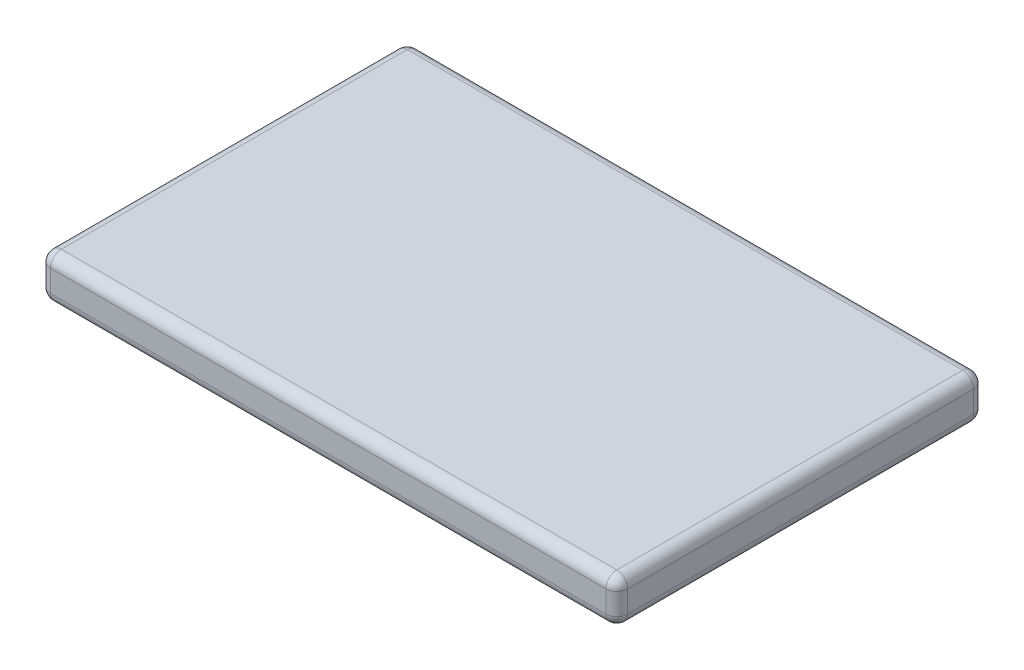
ISO-10303-21;
HEADER;
FILE_DESCRIPTION(('STEP AP214'),'2;1');
FILE_NAME('part.step','',(''),(''),'','','');
FILE_SCHEMA(('AUTOMOTIVE_DESIGN { 1 0 10303 214 1 1 1 1 }'));
ENDSEC;
DATA;
#1=APPLICATION_CONTEXT('core data for automotive mechanical design processes');
#2=APPLICATION_PROTOCOL_DEFINITION('international standard','automotive_design',2000,#1);
#3=PRODUCT_CONTEXT('',#1,'mechanical');
#4=PRODUCT('Part','Part','',(#3));
#5=PRODUCT_RELATED_PRODUCT_CATEGORY('part','',(#4));
#6=PRODUCT_DEFINITION_FORMATION('','',#4);
#7=PRODUCT_DEFINITION_CONTEXT('part definition',#1,'design');
#8=PRODUCT_DEFINITION('design','',#6,#7);
#9=PRODUCT_DEFINITION_SHAPE('','',#8);
#10=(LENGTH_UNIT() NAMED_UNIT(*) SI_UNIT(.MILLI.,.METRE.));
#11=(NAMED_UNIT(*) PLANE_ANGLE_UNIT() SI_UNIT($,.RADIAN.));
#12=(NAMED_UNIT(*) SI_UNIT($,.STERADIAN.) SOLID_ANGLE_UNIT());
#13=UNCERTAINTY_MEASURE_WITH_UNIT(LENGTH_MEASURE(1.E-05),#10,'distance_accuracy_value','');
#14=(GEOMETRIC_REPRESENTATION_CONTEXT(3) GLOBAL_UNCERTAINTY_ASSIGNED_CONTEXT((#13)) GLOBAL_UNIT_ASSIGNED_CONTEXT((#10,
#11,#12)) REPRESENTATION_CONTEXT('',''));
#15=CARTESIAN_POINT('',(0.,0.,0.));
#16=DIRECTION('',(0.,0.,1.));
#17=DIRECTION('',(1.,0.,0.));
#18=AXIS2_PLACEMENT_3D('',#15,#16,#17);
#19=CARTESIAN_POINT('',(50.75,-23.,136.6));
#20=DIRECTION('',(0.,-1.,0.));
#21=DIRECTION('',(1.,0.,0.));
#22=AXIS2_PLACEMENT_3D('',#19,#20,#21);
#23=SPHERICAL_SURFACE('',#22,2.);
#24=CARTESIAN_POINT('',(50.75,-23.,136.6));
#25=DIRECTION('',(0.,0.,-1.));
#26=DIRECTION('',(1.,0.,0.));
#27=AXIS2_PLACEMENT_3D('',#24,#25,#26);
#28=CIRCLE('',#27,2.);
#29=CARTESIAN_POINT('',(50.75,-21.,136.6));
#30=VERTEX_POINT('',#29);
#31=CARTESIAN_POINT('',(52.75,-23.,136.6));
#32=VERTEX_POINT('',#31);
#33=EDGE_CURVE('E10',#30,#32,#28,.T.);
#34=ORIENTED_EDGE('',*,*,#33,.F.);
#35=CARTESIAN_POINT('',(50.75,-23.,136.6));
#36=DIRECTION('',(1.,0.,0.));
#37=DIRECTION('',(0.,0.,1.));
#38=AXIS2_PLACEMENT_3D('',#35,#36,#37);
#39=CIRCLE('',#38,2.);
#40=CARTESIAN_POINT('',(50.75,-23.,138.6));
#41=VERTEX_POINT('',#40);
#42=EDGE_CURVE('E266',#30,#41,#39,.T.);
#43=ORIENTED_EDGE('',*,*,#42,.T.);
#44=CARTESIAN_POINT('',(50.75,-23.,136.6));
#45=DIRECTION('',(0.,-1.,0.));
#46=DIRECTION('',(1.,0.,0.));
#47=AXIS2_PLACEMENT_3D('',#44,#45,#46);
#48=CIRCLE('',#47,2.);
#49=EDGE_CURVE('E265',#32,#41,#48,.T.);
#50=ORIENTED_EDGE('',*,*,#49,.F.);
#51=EDGE_LOOP('',(#34,#43,#50));
#52=FACE_BOUND('',#51,.T.);
#53=ADVANCED_FACE('F16',(#52),#23,.T.);
#54=CARTESIAN_POINT('',(50.75,-23.,73.4));
#55=DIRECTION('',(0.,0.,1.));
#56=DIRECTION('',(1.,0.,0.));
#57=AXIS2_PLACEMENT_3D('',#54,#55,#56);
#58=SPHERICAL_SURFACE('',#57,2.);
#59=CARTESIAN_POINT('',(50.75,-23.,73.4));
#60=DIRECTION('',(0.,-1.,0.));
#61=DIRECTION('',(1.,0.,0.));
#62=AXIS2_PLACEMENT_3D('',#59,#60,#61);
#63=CIRCLE('',#62,2.);
#64=CARTESIAN_POINT('',(50.75,-23.,71.4));
#65=VERTEX_POINT('',#64);
#66=CARTESIAN_POINT('',(52.75,-23.,73.4));
#67=VERTEX_POINT('',#66);
#68=EDGE_CURVE('E275',#65,#67,#63,.T.);
#69=ORIENTED_EDGE('',*,*,#68,.F.);
#70=CARTESIAN_POINT('',(50.75,-23.,73.4));
#71=DIRECTION('',(1.,0.,0.));
#72=DIRECTION('',(0.,1.,0.));
#73=AXIS2_PLACEMENT_3D('',#70,#71,#72);
#74=CIRCLE('',#73,2.);
#75=CARTESIAN_POINT('',(50.75,-21.,73.4));
#76=VERTEX_POINT('',#75);
#77=EDGE_CURVE('E276',#65,#76,#74,.T.);
#78=ORIENTED_EDGE('',*,*,#77,.T.);
#79=CARTESIAN_POINT('',(50.75,-23.,73.4));
#80=DIRECTION('',(0.,0.,1.));
#81=DIRECTION('',(1.,0.,0.));
#82=AXIS2_PLACEMENT_3D('',#79,#80,#81);
#83=CIRCLE('',#82,2.);
#84=EDGE_CURVE('E24',#67,#76,#83,.T.);
#85=ORIENTED_EDGE('',*,*,#84,.F.);
#86=EDGE_LOOP('',(#69,#78,#85));
#87=FACE_BOUND('',#86,.T.);
#88=ADVANCED_FACE('F675',(#87),#58,.T.);
#89=CARTESIAN_POINT('',(52.75,-29.,71.4));
#90=DIRECTION('',(1.,0.,0.));
#91=DIRECTION('',(0.,1.,0.));
#92=AXIS2_PLACEMENT_3D('',#89,#90,#91);
#93=PLANE('',#92);
#94=DIRECTION('',(0.,0.,1.));
#95=VECTOR('',#94,1.);
#96=CARTESIAN_POINT('',(52.75,-27.,71.4));
#97=LINE('',#96,#95);
#98=CARTESIAN_POINT('',(52.75,-27.,73.4));
#99=VERTEX_POINT('',#98);
#100=CARTESIAN_POINT('',(52.75,-27.,136.6));
#101=VERTEX_POINT('',#100);
#102=EDGE_CURVE('E295',#99,#101,#97,.T.);
#103=ORIENTED_EDGE('',*,*,#102,.F.);
#104=DIRECTION('',(0.,1.,0.));
#105=VECTOR('',#104,1.);
#106=CARTESIAN_POINT('',(52.75,-29.,73.4));
#107=LINE('',#106,#105);
#108=EDGE_CURVE('E307',#99,#67,#107,.T.);
#109=ORIENTED_EDGE('',*,*,#108,.T.);
#110=DIRECTION('',(0.,0.,1.));
#111=VECTOR('',#110,1.);
#112=CARTESIAN_POINT('',(52.75,-23.,71.4));
#113=LINE('',#112,#111);
#114=EDGE_CURVE('E298',#67,#32,#113,.T.);
#115=ORIENTED_EDGE('',*,*,#114,.T.);
#116=DIRECTION('',(0.,1.,0.));
#117=VECTOR('',#116,1.);
#118=CARTESIAN_POINT('',(52.75,-29.,136.6));
#119=LINE('',#118,#117);
#120=EDGE_CURVE('E262',#101,#32,#119,.T.);
#121=ORIENTED_EDGE('',*,*,#120,.F.);
#122=EDGE_LOOP('',(#103,#109,#115,#121));
#123=FACE_BOUND('',#122,.T.);
#124=ADVANCED_FACE('F666',(#123),#93,.T.);
#125=CARTESIAN_POINT('',(50.75,-27.,136.6));
#126=DIRECTION('',(0.,0.,-1.));
#127=DIRECTION('',(1.,0.,0.));
#128=AXIS2_PLACEMENT_3D('',#125,#126,#127);
#129=SPHERICAL_SURFACE('',#128,2.);
#130=CARTESIAN_POINT('',(50.75,-27.,136.6));
#131=DIRECTION('',(0.,1.,0.));
#132=DIRECTION('',(1.,0.,0.));
#133=AXIS2_PLACEMENT_3D('',#130,#131,#132);
#134=CIRCLE('',#133,2.);
#135=CARTESIAN_POINT('',(50.75,-27.,138.6));
#136=VERTEX_POINT('',#135);
#137=EDGE_CURVE('E269',#136,#101,#134,.T.);
#138=ORIENTED_EDGE('',*,*,#137,.F.);
#139=CARTESIAN_POINT('',(50.75,-27.,136.6));
#140=DIRECTION('',(1.,0.,0.));
#141=DIRECTION('',(0.,-1.,0.));
#142=AXIS2_PLACEMENT_3D('',#139,#140,#141);
#143=CIRCLE('',#142,2.);
#144=CARTESIAN_POINT('',(50.75,-29.,136.6));
#145=VERTEX_POINT('',#144);
#146=EDGE_CURVE('E253',#136,#145,#143,.T.);
#147=ORIENTED_EDGE('',*,*,#146,.T.);
#148=CARTESIAN_POINT('',(50.75,-27.,136.6));
#149=DIRECTION('',(0.,0.,-1.));
#150=DIRECTION('',(1.,0.,0.));
#151=AXIS2_PLACEMENT_3D('',#148,#149,#150);
#152=CIRCLE('',#151,2.);
#153=EDGE_CURVE('E249',#101,#145,#152,.T.);
#154=ORIENTED_EDGE('',*,*,#153,.F.);
#155=EDGE_LOOP('',(#138,#147,#154));
#156=FACE_BOUND('',#155,.T.);
#157=ADVANCED_FACE('F578',(#156),#129,.T.);
#158=CARTESIAN_POINT('',(50.75,-27.,73.4));
#159=DIRECTION('',(0.,0.,1.));
#160=DIRECTION('',(1.,0.,0.));
#161=AXIS2_PLACEMENT_3D('',#158,#159,#160);
#162=SPHERICAL_SURFACE('',#161,2.);
#163=CARTESIAN_POINT('',(50.75,-27.,73.4));
#164=DIRECTION('',(0.,0.,-1.));
#165=DIRECTION('',(1.,0.,0.));
#166=AXIS2_PLACEMENT_3D('',#163,#164,#165);
#167=CIRCLE('',#166,2.);
#168=CARTESIAN_POINT('',(50.75,-29.,73.4));
#169=VERTEX_POINT('',#168);
#170=EDGE_CURVE('E252',#99,#169,#167,.T.);
#171=ORIENTED_EDGE('',*,*,#170,.T.);
#172=CARTESIAN_POINT('',(50.75,-27.,73.4));
#173=DIRECTION('',(-1.,0.,0.));
#174=DIRECTION('',(0.,-1.,0.));
#175=AXIS2_PLACEMENT_3D('',#172,#173,#174);
#176=CIRCLE('',#175,2.);
#177=CARTESIAN_POINT('',(50.75,-27.,71.4));
#178=VERTEX_POINT('',#177);
#179=EDGE_CURVE('E286',#178,#169,#176,.T.);
#180=ORIENTED_EDGE('',*,*,#179,.F.);
#181=CARTESIAN_POINT('',(50.75,-27.,73.4));
#182=DIRECTION('',(0.,-1.,0.));
#183=DIRECTION('',(1.,0.,0.));
#184=AXIS2_PLACEMENT_3D('',#181,#182,#183);
#185=CIRCLE('',#184,2.);
#186=EDGE_CURVE('E271',#178,#99,#185,.T.);
#187=ORIENTED_EDGE('',*,*,#186,.T.);
#188=EDGE_LOOP('',(#171,#180,#187));
#189=FACE_BOUND('',#188,.T.);
#190=ADVANCED_FACE('F572',(#189),#162,.T.);
#191=CARTESIAN_POINT('',(50.75,-23.,71.4));
#192=DIRECTION('',(0.,0.,1.));
#193=DIRECTION('',(1.,0.,0.));
#194=AXIS2_PLACEMENT_3D('',#191,#192,#193);
#195=CYLINDRICAL_SURFACE('',#194,2.);
#196=ORIENTED_EDGE('',*,*,#114,.F.);
#197=ORIENTED_EDGE('',*,*,#84,.T.);
#198=DIRECTION('',(0.,0.,1.));
#199=VECTOR('',#198,1.);
#200=CARTESIAN_POINT('',(50.75,-21.,71.4));
#201=LINE('',#200,#199);
#202=EDGE_CURVE('E279',#76,#30,#201,.T.);
#203=ORIENTED_EDGE('',*,*,#202,.T.);
#204=ORIENTED_EDGE('',*,*,#33,.T.);
#205=EDGE_LOOP('',(#196,#197,#203,#204));
#206=FACE_BOUND('',#205,.T.);
#207=ADVANCED_FACE('F577',(#206),#195,.T.);
#208=CARTESIAN_POINT('',(50.75,-29.,136.6));
#209=DIRECTION('',(0.,1.,0.));
#210=DIRECTION('',(1.,0.,0.));
#211=AXIS2_PLACEMENT_3D('',#208,#209,#210);
#212=CYLINDRICAL_SURFACE('',#211,2.);
#213=ORIENTED_EDGE('',*,*,#120,.T.);
#214=ORIENTED_EDGE('',*,*,#49,.T.);
#215=DIRECTION('',(0.,1.,0.));
#216=VECTOR('',#215,1.);
#217=CARTESIAN_POINT('',(50.75,-29.,138.6));
#218=LINE('',#217,#216);
#219=EDGE_CURVE('E153',#136,#41,#218,.T.);
#220=ORIENTED_EDGE('',*,*,#219,.F.);
#221=ORIENTED_EDGE('',*,*,#137,.T.);
#222=EDGE_LOOP('',(#213,#214,#220,#221));
#223=FACE_BOUND('',#222,.T.);
#224=ADVANCED_FACE('F646',(#223),#212,.T.);
#225=CARTESIAN_POINT('',(-52.75,-23.,136.6));
#226=DIRECTION('',(1.,0.,0.));
#227=DIRECTION('',(0.,1.,0.));
#228=AXIS2_PLACEMENT_3D('',#225,#226,#227);
#229=CYLINDRICAL_SURFACE('',#228,2.);
#230=CARTESIAN_POINT('',(-50.75,-23.,136.6));
#231=DIRECTION('',(1.,0.,0.));
#232=DIRECTION('',(0.,0.,1.));
#233=AXIS2_PLACEMENT_3D('',#230,#231,#232);
#234=CIRCLE('',#233,2.);
#235=CARTESIAN_POINT('',(-50.75,-21.,136.6));
#236=VERTEX_POINT('',#235);
#237=CARTESIAN_POINT('',(-50.75,-23.,138.6));
#238=VERTEX_POINT('',#237);
#239=EDGE_CURVE('E132',#236,#238,#234,.T.);
#240=ORIENTED_EDGE('',*,*,#239,.T.);
#241=DIRECTION('',(1.,0.,0.));
#242=VECTOR('',#241,1.);
#243=CARTESIAN_POINT('',(-52.75,-23.,138.6));
#244=LINE('',#243,#242);
#245=EDGE_CURVE('E136',#238,#41,#244,.T.);
#246=ORIENTED_EDGE('',*,*,#245,.T.);
#247=ORIENTED_EDGE('',*,*,#42,.F.);
#248=DIRECTION('',(1.,0.,0.));
#249=VECTOR('',#248,1.);
#250=CARTESIAN_POINT('',(-52.75,-21.,136.6));
#251=LINE('',#250,#249);
#252=EDGE_CURVE('E139',#236,#30,#251,.T.);
#253=ORIENTED_EDGE('',*,*,#252,.F.);
#254=EDGE_LOOP('',(#240,#246,#247,#253));
#255=FACE_BOUND('',#254,.T.);
#256=ADVANCED_FACE('F134',(#255),#229,.T.);
#257=CARTESIAN_POINT('',(50.75,-29.,73.4));
#258=DIRECTION('',(0.,1.,0.));
#259=DIRECTION('',(1.,0.,0.));
#260=AXIS2_PLACEMENT_3D('',#257,#258,#259);
#261=CYLINDRICAL_SURFACE('',#260,2.);
#262=ORIENTED_EDGE('',*,*,#186,.F.);
#263=DIRECTION('',(0.,1.,0.));
#264=VECTOR('',#263,1.);
#265=CARTESIAN_POINT('',(50.75,-29.,71.4));
#266=LINE('',#265,#264);
#267=EDGE_CURVE('E240',#178,#65,#266,.T.);
#268=ORIENTED_EDGE('',*,*,#267,.T.);
#269=ORIENTED_EDGE('',*,*,#68,.T.);
#270=ORIENTED_EDGE('',*,*,#108,.F.);
#271=EDGE_LOOP('',(#262,#268,#269,#270));
#272=FACE_BOUND('',#271,.T.);
#273=ADVANCED_FACE('F629',(#272),#261,.T.);
#274=CARTESIAN_POINT('',(-52.75,-23.,73.4));
#275=DIRECTION('',(1.,0.,0.));
#276=DIRECTION('',(0.,1.,0.));
#277=AXIS2_PLACEMENT_3D('',#274,#275,#276);
#278=CYLINDRICAL_SURFACE('',#277,2.);
#279=DIRECTION('',(1.,0.,0.));
#280=VECTOR('',#279,1.);
#281=CARTESIAN_POINT('',(-52.75,-21.,73.4));
#282=LINE('',#281,#280);
#283=CARTESIAN_POINT('',(-50.75,-21.,73.4));
#284=VERTEX_POINT('',#283);
#285=EDGE_CURVE('E282',#284,#76,#282,.T.);
#286=ORIENTED_EDGE('',*,*,#285,.T.);
#287=ORIENTED_EDGE('',*,*,#77,.F.);
#288=DIRECTION('',(1.,0.,0.));
#289=VECTOR('',#288,1.);
#290=CARTESIAN_POINT('',(-52.75,-23.,71.4));
#291=LINE('',#290,#289);
#292=CARTESIAN_POINT('',(-50.75,-23.,71.4));
#293=VERTEX_POINT('',#292);
#294=EDGE_CURVE('E236',#293,#65,#291,.T.);
#295=ORIENTED_EDGE('',*,*,#294,.F.);
#296=CARTESIAN_POINT('',(-50.75,-23.,73.4));
#297=DIRECTION('',(1.,0.,0.));
#298=DIRECTION('',(0.,1.,0.));
#299=AXIS2_PLACEMENT_3D('',#296,#297,#298);
#300=CIRCLE('',#299,2.);
#301=EDGE_CURVE('E248',#293,#284,#300,.T.);
#302=ORIENTED_EDGE('',*,*,#301,.T.);
#303=EDGE_LOOP('',(#286,#287,#295,#302));
#304=FACE_BOUND('',#303,.T.);
#305=ADVANCED_FACE('F512',(#304),#278,.T.);
#306=CARTESIAN_POINT('',(50.75,-27.,71.4));
#307=DIRECTION('',(0.,0.,1.));
#308=DIRECTION('',(1.,0.,0.));
#309=AXIS2_PLACEMENT_3D('',#306,#307,#308);
#310=CYLINDRICAL_SURFACE('',#309,2.);
#311=ORIENTED_EDGE('',*,*,#153,.T.);
#312=DIRECTION('',(0.,0.,1.));
#313=VECTOR('',#312,1.);
#314=CARTESIAN_POINT('',(50.75,-29.,71.4));
#315=LINE('',#314,#313);
#316=EDGE_CURVE('E228',#169,#145,#315,.T.);
#317=ORIENTED_EDGE('',*,*,#316,.F.);
#318=ORIENTED_EDGE('',*,*,#170,.F.);
#319=ORIENTED_EDGE('',*,*,#102,.T.);
#320=EDGE_LOOP('',(#311,#317,#318,#319));
#321=FACE_BOUND('',#320,.T.);
#322=ADVANCED_FACE('F506',(#321),#310,.T.);
#323=CARTESIAN_POINT('',(-52.75,-27.,136.6));
#324=DIRECTION('',(1.,0.,0.));
#325=DIRECTION('',(0.,-1.,0.));
#326=AXIS2_PLACEMENT_3D('',#323,#324,#325);
#327=CYLINDRICAL_SURFACE('',#326,2.);
#328=DIRECTION('',(1.,0.,0.));
#329=VECTOR('',#328,1.);
#330=CARTESIAN_POINT('',(-52.75,-29.,136.6));
#331=LINE('',#330,#329);
#332=CARTESIAN_POINT('',(-50.75,-29.,136.6));
#333=VERTEX_POINT('',#332);
#334=EDGE_CURVE('E232',#333,#145,#331,.T.);
#335=ORIENTED_EDGE('',*,*,#334,.T.);
#336=ORIENTED_EDGE('',*,*,#146,.F.);
#337=DIRECTION('',(1.,0.,0.));
#338=VECTOR('',#337,1.);
#339=CARTESIAN_POINT('',(-52.75,-27.,138.6));
#340=LINE('',#339,#338);
#341=CARTESIAN_POINT('',(-50.75,-27.,138.6));
#342=VERTEX_POINT('',#341);
#343=EDGE_CURVE('E257',#342,#136,#340,.T.);
#344=ORIENTED_EDGE('',*,*,#343,.F.);
#345=CARTESIAN_POINT('',(-50.75,-27.,136.6));
#346=DIRECTION('',(1.,0.,0.));
#347=DIRECTION('',(0.,-1.,0.));
#348=AXIS2_PLACEMENT_3D('',#345,#346,#347);
#349=CIRCLE('',#348,2.);
#350=EDGE_CURVE('E220',#342,#333,#349,.T.);
#351=ORIENTED_EDGE('',*,*,#350,.T.);
#352=EDGE_LOOP('',(#335,#336,#344,#351));
#353=FACE_BOUND('',#352,.T.);
#354=ADVANCED_FACE('F511',(#353),#327,.T.);
#355=CARTESIAN_POINT('',(-52.75,-27.,73.4));
#356=DIRECTION('',(1.,0.,0.));
#357=DIRECTION('',(0.,-1.,0.));
#358=AXIS2_PLACEMENT_3D('',#355,#356,#357);
#359=CYLINDRICAL_SURFACE('',#358,2.);
#360=CARTESIAN_POINT('',(-50.75,-27.,73.4));
#361=DIRECTION('',(-1.,0.,0.));
#362=DIRECTION('',(0.,-1.,0.));
#363=AXIS2_PLACEMENT_3D('',#360,#361,#362);
#364=CIRCLE('',#363,2.);
#365=CARTESIAN_POINT('',(-50.75,-27.,71.4));
#366=VERTEX_POINT('',#365);
#367=CARTESIAN_POINT('',(-50.75,-29.,73.4));
#368=VERTEX_POINT('',#367);
#369=EDGE_CURVE('E196',#366,#368,#364,.T.);
#370=ORIENTED_EDGE('',*,*,#369,.F.);
#371=DIRECTION('',(1.,0.,0.));
#372=VECTOR('',#371,1.);
#373=CARTESIAN_POINT('',(-52.75,-27.,71.4));
#374=LINE('',#373,#372);
#375=EDGE_CURVE('E244',#366,#178,#374,.T.);
#376=ORIENTED_EDGE('',*,*,#375,.T.);
#377=ORIENTED_EDGE('',*,*,#179,.T.);
#378=DIRECTION('',(1.,0.,0.));
#379=VECTOR('',#378,1.);
#380=CARTESIAN_POINT('',(-52.75,-29.,73.4));
#381=LINE('',#380,#379);
#382=EDGE_CURVE('E224',#368,#169,#381,.T.);
#383=ORIENTED_EDGE('',*,*,#382,.F.);
#384=EDGE_LOOP('',(#370,#376,#377,#383));
#385=FACE_BOUND('',#384,.T.);
#386=ADVANCED_FACE('F545',(#385),#359,.T.);
#387=CARTESIAN_POINT('',(-52.75,-21.,71.4));
#388=DIRECTION('',(0.,1.,0.));
#389=DIRECTION('',(1.,0.,0.));
#390=AXIS2_PLACEMENT_3D('',#387,#388,#389);
#391=PLANE('',#390);
#392=DIRECTION('',(0.,0.,1.));
#393=VECTOR('',#392,1.);
#394=CARTESIAN_POINT('',(-50.75,-21.,71.4));
#395=LINE('',#394,#393);
#396=EDGE_CURVE('E187',#284,#236,#395,.T.);
#397=ORIENTED_EDGE('',*,*,#396,.T.);
#398=ORIENTED_EDGE('',*,*,#252,.T.);
#399=ORIENTED_EDGE('',*,*,#202,.F.);
#400=ORIENTED_EDGE('',*,*,#285,.F.);
#401=EDGE_LOOP('',(#397,#398,#399,#400));
#402=FACE_BOUND('',#401,.T.);
#403=ADVANCED_FACE('F550',(#402),#391,.T.);
#404=CARTESIAN_POINT('',(-50.75,-23.,136.6));
#405=DIRECTION('',(0.,-1.,0.));
#406=DIRECTION('',(-1.,0.,0.));
#407=AXIS2_PLACEMENT_3D('',#404,#405,#406);
#408=SPHERICAL_SURFACE('',#407,2.);
#409=CARTESIAN_POINT('',(-50.75,-23.,136.6));
#410=DIRECTION('',(0.,1.,0.));
#411=DIRECTION('',(-1.,0.,0.));
#412=AXIS2_PLACEMENT_3D('',#409,#410,#411);
#413=CIRCLE('',#412,2.);
#414=CARTESIAN_POINT('',(-52.75,-23.,136.6));
#415=VERTEX_POINT('',#414);
#416=EDGE_CURVE('E157',#415,#238,#413,.T.);
#417=ORIENTED_EDGE('',*,*,#416,.T.);
#418=ORIENTED_EDGE('',*,*,#239,.F.);
#419=CARTESIAN_POINT('',(-50.75,-23.,136.6));
#420=DIRECTION('',(0.,0.,1.));
#421=DIRECTION('',(-1.,0.,0.));
#422=AXIS2_PLACEMENT_3D('',#419,#420,#421);
#423=CIRCLE('',#422,2.);
#424=EDGE_CURVE('E160',#236,#415,#423,.T.);
#425=ORIENTED_EDGE('',*,*,#424,.T.);
#426=EDGE_LOOP('',(#417,#418,#425));
#427=FACE_BOUND('',#426,.T.);
#428=ADVANCED_FACE('F158',(#427),#408,.T.);
#429=CARTESIAN_POINT('',(-52.75,-29.,138.6));
#430=DIRECTION('',(0.,0.,1.));
#431=DIRECTION('',(1.,0.,0.));
#432=AXIS2_PLACEMENT_3D('',#429,#430,#431);
#433=PLANE('',#432);
#434=DIRECTION('',(0.,1.,0.));
#435=VECTOR('',#434,1.);
#436=CARTESIAN_POINT('',(-50.75,-29.,138.6));
#437=LINE('',#436,#435);
#438=EDGE_CURVE('E150',#342,#238,#437,.T.);
#439=ORIENTED_EDGE('',*,*,#438,.F.);
#440=ORIENTED_EDGE('',*,*,#343,.T.);
#441=ORIENTED_EDGE('',*,*,#219,.T.);
#442=ORIENTED_EDGE('',*,*,#245,.F.);
#443=EDGE_LOOP('',(#439,#440,#441,#442));
#444=FACE_BOUND('',#443,.T.);
#445=ADVANCED_FACE('F147',(#444),#433,.T.);
#446=CARTESIAN_POINT('',(-50.75,-23.,73.4));
#447=DIRECTION('',(0.,0.,1.));
#448=DIRECTION('',(-1.,0.,0.));
#449=AXIS2_PLACEMENT_3D('',#446,#447,#448);
#450=SPHERICAL_SURFACE('',#449,2.);
#451=CARTESIAN_POINT('',(-50.75,-23.,73.4));
#452=DIRECTION('',(0.,0.,-1.));
#453=DIRECTION('',(-1.,0.,0.));
#454=AXIS2_PLACEMENT_3D('',#451,#452,#453);
#455=CIRCLE('',#454,2.);
#456=CARTESIAN_POINT('',(-52.75,-23.,73.4));
#457=VERTEX_POINT('',#456);
#458=EDGE_CURVE('E192',#457,#284,#455,.T.);
#459=ORIENTED_EDGE('',*,*,#458,.T.);
#460=ORIENTED_EDGE('',*,*,#301,.F.);
#461=CARTESIAN_POINT('',(-50.75,-23.,73.4));
#462=DIRECTION('',(0.,1.,0.));
#463=DIRECTION('',(-1.,0.,0.));
#464=AXIS2_PLACEMENT_3D('',#461,#462,#463);
#465=CIRCLE('',#464,2.);
#466=EDGE_CURVE('E210',#293,#457,#465,.T.);
#467=ORIENTED_EDGE('',*,*,#466,.T.);
#468=EDGE_LOOP('',(#459,#460,#467));
#469=FACE_BOUND('',#468,.T.);
#470=ADVANCED_FACE('F526',(#469),#450,.T.);
#471=CARTESIAN_POINT('',(-52.75,-29.,71.4));
#472=DIRECTION('',(0.,0.,1.));
#473=DIRECTION('',(1.,0.,0.));
#474=AXIS2_PLACEMENT_3D('',#471,#472,#473);
#475=PLANE('',#474);
#476=ORIENTED_EDGE('',*,*,#294,.T.);
#477=ORIENTED_EDGE('',*,*,#267,.F.);
#478=ORIENTED_EDGE('',*,*,#375,.F.);
#479=DIRECTION('',(0.,1.,0.));
#480=VECTOR('',#479,1.);
#481=CARTESIAN_POINT('',(-50.75,-29.,71.4));
#482=LINE('',#481,#480);
#483=EDGE_CURVE('E205',#366,#293,#482,.T.);
#484=ORIENTED_EDGE('',*,*,#483,.T.);
#485=EDGE_LOOP('',(#476,#477,#478,#484));
#486=FACE_BOUND('',#485,.T.);
#487=ADVANCED_FACE('F531',(#486),#475,.F.);
#488=CARTESIAN_POINT('',(-52.75,-29.,71.4));
#489=DIRECTION('',(0.,1.,0.));
#490=DIRECTION('',(1.,0.,0.));
#491=AXIS2_PLACEMENT_3D('',#488,#489,#490);
#492=PLANE('',#491);
#493=ORIENTED_EDGE('',*,*,#382,.T.);
#494=ORIENTED_EDGE('',*,*,#316,.T.);
#495=ORIENTED_EDGE('',*,*,#334,.F.);
#496=DIRECTION('',(0.,0.,1.));
#497=VECTOR('',#496,1.);
#498=CARTESIAN_POINT('',(-50.75,-29.,71.4));
#499=LINE('',#498,#497);
#500=EDGE_CURVE('E202',#368,#333,#499,.T.);
#501=ORIENTED_EDGE('',*,*,#500,.F.);
#502=EDGE_LOOP('',(#493,#494,#495,#501));
#503=FACE_BOUND('',#502,.T.);
#504=ADVANCED_FACE('F567',(#503),#492,.F.);
#505=CARTESIAN_POINT('',(-50.75,-27.,136.6));
#506=DIRECTION('',(0.,0.,-1.));
#507=DIRECTION('',(-1.,0.,0.));
#508=AXIS2_PLACEMENT_3D('',#505,#506,#507);
#509=SPHERICAL_SURFACE('',#508,2.);
#510=CARTESIAN_POINT('',(-50.75,-27.,136.6));
#511=DIRECTION('',(0.,0.,1.));
#512=DIRECTION('',(-1.,0.,0.));
#513=AXIS2_PLACEMENT_3D('',#510,#511,#512);
#514=CIRCLE('',#513,2.);
#515=CARTESIAN_POINT('',(-52.75,-27.,136.6));
#516=VERTEX_POINT('',#515);
#517=EDGE_CURVE('E209',#516,#333,#514,.T.);
#518=ORIENTED_EDGE('',*,*,#517,.T.);
#519=ORIENTED_EDGE('',*,*,#350,.F.);
#520=CARTESIAN_POINT('',(-50.75,-27.,136.6));
#521=DIRECTION('',(0.,-1.,0.));
#522=DIRECTION('',(-1.,0.,0.));
#523=AXIS2_PLACEMENT_3D('',#520,#521,#522);
#524=CIRCLE('',#523,2.);
#525=EDGE_CURVE('E167',#342,#516,#524,.T.);
#526=ORIENTED_EDGE('',*,*,#525,.T.);
#527=EDGE_LOOP('',(#518,#519,#526));
#528=FACE_BOUND('',#527,.T.);
#529=ADVANCED_FACE('F559',(#528),#509,.T.);
#530=CARTESIAN_POINT('',(-50.75,-27.,73.4));
#531=DIRECTION('',(0.,0.,1.));
#532=DIRECTION('',(-1.,0.,0.));
#533=AXIS2_PLACEMENT_3D('',#530,#531,#532);
#534=SPHERICAL_SURFACE('',#533,2.);
#535=CARTESIAN_POINT('',(-50.75,-27.,73.4));
#536=DIRECTION('',(0.,1.,0.));
#537=DIRECTION('',(-1.,0.,0.));
#538=AXIS2_PLACEMENT_3D('',#535,#536,#537);
#539=CIRCLE('',#538,2.);
#540=CARTESIAN_POINT('',(-52.75,-27.,73.4));
#541=VERTEX_POINT('',#540);
#542=EDGE_CURVE('E174',#366,#541,#539,.T.);
#543=ORIENTED_EDGE('',*,*,#542,.F.);
#544=ORIENTED_EDGE('',*,*,#369,.T.);
#545=CARTESIAN_POINT('',(-50.75,-27.,73.4));
#546=DIRECTION('',(0.,0.,1.));
#547=DIRECTION('',(-1.,0.,0.));
#548=AXIS2_PLACEMENT_3D('',#545,#546,#547);
#549=CIRCLE('',#548,2.);
#550=EDGE_CURVE('E191',#541,#368,#549,.T.);
#551=ORIENTED_EDGE('',*,*,#550,.F.);
#552=EDGE_LOOP('',(#543,#544,#551));
#553=FACE_BOUND('',#552,.T.);
#554=ADVANCED_FACE('F348',(#553),#534,.T.);
#555=CARTESIAN_POINT('',(-50.75,-23.,71.4));
#556=DIRECTION('',(0.,0.,1.));
#557=DIRECTION('',(-1.,0.,0.));
#558=AXIS2_PLACEMENT_3D('',#555,#556,#557);
#559=CYLINDRICAL_SURFACE('',#558,2.);
#560=ORIENTED_EDGE('',*,*,#424,.F.);
#561=ORIENTED_EDGE('',*,*,#396,.F.);
#562=ORIENTED_EDGE('',*,*,#458,.F.);
#563=DIRECTION('',(0.,0.,1.));
#564=VECTOR('',#563,1.);
#565=CARTESIAN_POINT('',(-52.75,-23.,71.4));
#566=LINE('',#565,#564);
#567=EDGE_CURVE('E178',#457,#415,#566,.T.);
#568=ORIENTED_EDGE('',*,*,#567,.T.);
#569=EDGE_LOOP('',(#560,#561,#562,#568));
#570=FACE_BOUND('',#569,.T.);
#571=ADVANCED_FACE('F336',(#570),#559,.T.);
#572=CARTESIAN_POINT('',(-50.75,-29.,136.6));
#573=DIRECTION('',(0.,1.,0.));
#574=DIRECTION('',(-1.,0.,0.));
#575=AXIS2_PLACEMENT_3D('',#572,#573,#574);
#576=CYLINDRICAL_SURFACE('',#575,2.);
#577=ORIENTED_EDGE('',*,*,#525,.F.);
#578=ORIENTED_EDGE('',*,*,#438,.T.);
#579=ORIENTED_EDGE('',*,*,#416,.F.);
#580=DIRECTION('',(0.,1.,0.));
#581=VECTOR('',#580,1.);
#582=CARTESIAN_POINT('',(-52.75,-29.,136.6));
#583=LINE('',#582,#581);
#584=EDGE_CURVE('E325',#516,#415,#583,.T.);
#585=ORIENTED_EDGE('',*,*,#584,.F.);
#586=EDGE_LOOP('',(#577,#578,#579,#585));
#587=FACE_BOUND('',#586,.T.);
#588=ADVANCED_FACE('F166',(#587),#576,.T.);
#589=CARTESIAN_POINT('',(-50.75,-29.,73.4));
#590=DIRECTION('',(0.,1.,0.));
#591=DIRECTION('',(-1.,0.,0.));
#592=AXIS2_PLACEMENT_3D('',#589,#590,#591);
#593=CYLINDRICAL_SURFACE('',#592,2.);
#594=DIRECTION('',(0.,1.,0.));
#595=VECTOR('',#594,1.);
#596=CARTESIAN_POINT('',(-52.75,-29.,73.4));
#597=LINE('',#596,#595);
#598=EDGE_CURVE('E180',#541,#457,#597,.T.);
#599=ORIENTED_EDGE('',*,*,#598,.T.);
#600=ORIENTED_EDGE('',*,*,#466,.F.);
#601=ORIENTED_EDGE('',*,*,#483,.F.);
#602=ORIENTED_EDGE('',*,*,#542,.T.);
#603=EDGE_LOOP('',(#599,#600,#601,#602));
#604=FACE_BOUND('',#603,.T.);
#605=ADVANCED_FACE('F343',(#604),#593,.T.);
#606=CARTESIAN_POINT('',(-50.75,-27.,71.4));
#607=DIRECTION('',(0.,0.,1.));
#608=DIRECTION('',(-1.,0.,0.));
#609=AXIS2_PLACEMENT_3D('',#606,#607,#608);
#610=CYLINDRICAL_SURFACE('',#609,2.);
#611=DIRECTION('',(0.,0.,1.));
#612=VECTOR('',#611,1.);
#613=CARTESIAN_POINT('',(-52.75,-27.,71.4));
#614=LINE('',#613,#612);
#615=EDGE_CURVE('E184',#541,#516,#614,.T.);
#616=ORIENTED_EDGE('',*,*,#615,.F.);
#617=ORIENTED_EDGE('',*,*,#550,.T.);
#618=ORIENTED_EDGE('',*,*,#500,.T.);
#619=ORIENTED_EDGE('',*,*,#517,.F.);
#620=EDGE_LOOP('',(#616,#617,#618,#619));
#621=FACE_BOUND('',#620,.T.);
#622=ADVANCED_FACE('F353',(#621),#610,.T.);
#623=CARTESIAN_POINT('',(-52.75,-29.,71.4));
#624=DIRECTION('',(1.,0.,0.));
#625=DIRECTION('',(0.,1.,0.));
#626=AXIS2_PLACEMENT_3D('',#623,#624,#625);
#627=PLANE('',#626);
#628=ORIENTED_EDGE('',*,*,#584,.T.);
#629=ORIENTED_EDGE('',*,*,#567,.F.);
#630=ORIENTED_EDGE('',*,*,#598,.F.);
#631=ORIENTED_EDGE('',*,*,#615,.T.);
#632=EDGE_LOOP('',(#628,#629,#630,#631));
#633=FACE_BOUND('',#632,.T.);
#634=ADVANCED_FACE('F339',(#633),#627,.F.);
#635=CLOSED_SHELL('',(#53,#88,#124,#157,#190,#207,#224,#256,#273,#305,#322,#354,#386,#403,#428,
#445,#470,#487,#504,#529,#554,#571,#588,#605,#622,#634));
#636=MANIFOLD_SOLID_BREP('B1',#635);
#637=ADVANCED_BREP_SHAPE_REPRESENTATION('',(#18,#636),#14);
#638=SHAPE_DEFINITION_REPRESENTATION(#9,#637);
ENDSEC;
END-ISO-10303-21;
